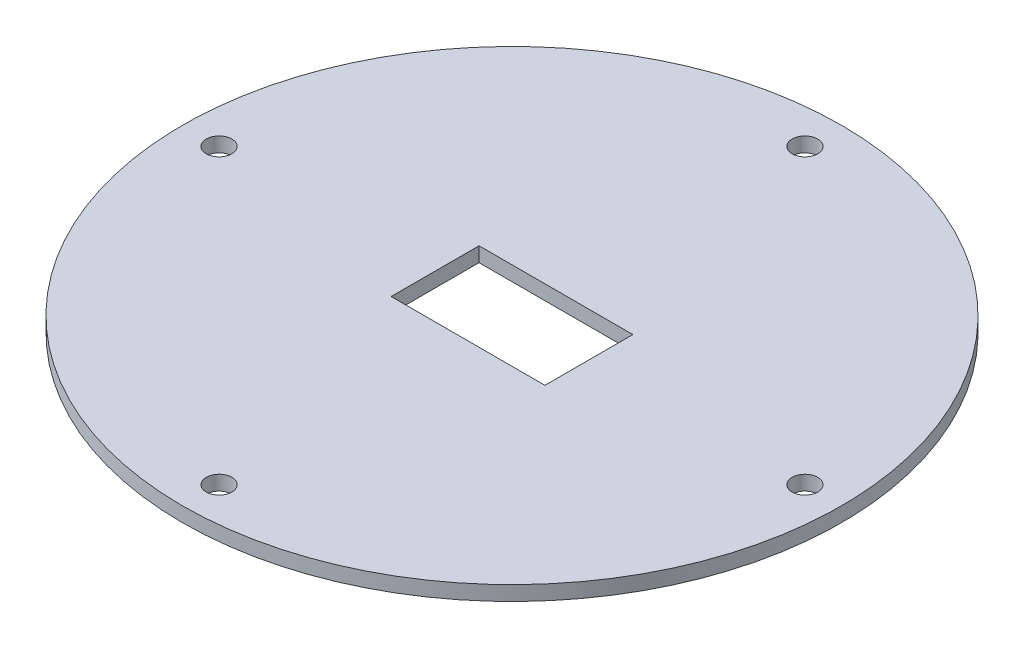
ISO-10303-21;
HEADER;
FILE_DESCRIPTION(('STEP AP214'),'2;1');
FILE_NAME('part.step','',(''),(''),'','','');
FILE_SCHEMA(('AUTOMOTIVE_DESIGN { 1 0 10303 214 1 1 1 1 }'));
ENDSEC;
DATA;
#1=APPLICATION_CONTEXT('core data for automotive mechanical design processes');
#2=APPLICATION_PROTOCOL_DEFINITION('international standard','automotive_design',2000,#1);
#3=PRODUCT_CONTEXT('',#1,'mechanical');
#4=PRODUCT('Part','Part','',(#3));
#5=PRODUCT_RELATED_PRODUCT_CATEGORY('part','',(#4));
#6=PRODUCT_DEFINITION_FORMATION('','',#4);
#7=PRODUCT_DEFINITION_CONTEXT('part definition',#1,'design');
#8=PRODUCT_DEFINITION('design','',#6,#7);
#9=PRODUCT_DEFINITION_SHAPE('','',#8);
#10=(LENGTH_UNIT() NAMED_UNIT(*) SI_UNIT(.MILLI.,.METRE.));
#11=(NAMED_UNIT(*) PLANE_ANGLE_UNIT() SI_UNIT($,.RADIAN.));
#12=(NAMED_UNIT(*) SI_UNIT($,.STERADIAN.) SOLID_ANGLE_UNIT());
#13=UNCERTAINTY_MEASURE_WITH_UNIT(LENGTH_MEASURE(1.E-05),#10,'distance_accuracy_value','');
#14=(GEOMETRIC_REPRESENTATION_CONTEXT(3) GLOBAL_UNCERTAINTY_ASSIGNED_CONTEXT((#13)) GLOBAL_UNIT_ASSIGNED_CONTEXT((#10,
#11,#12)) REPRESENTATION_CONTEXT('',''));
#15=CARTESIAN_POINT('',(0.,0.,0.));
#16=DIRECTION('',(0.,0.,1.));
#17=DIRECTION('',(1.,0.,0.));
#18=AXIS2_PLACEMENT_3D('',#15,#16,#17);
#19=CARTESIAN_POINT('',(0.,2.,0.));
#20=DIRECTION('',(0.,-1.,0.));
#21=DIRECTION('',(0.,0.,-1.));
#22=AXIS2_PLACEMENT_3D('',#19,#20,#21);
#23=CYLINDRICAL_SURFACE('',#22,45.);
#24=CARTESIAN_POINT('',(0.,2.,0.));
#25=DIRECTION('',(0.,1.,0.));
#26=DIRECTION('',(0.,0.,1.));
#27=AXIS2_PLACEMENT_3D('',#24,#25,#26);
#28=CIRCLE('',#27,45.);
#29=CARTESIAN_POINT('',(0.,2.,45.));
#30=VERTEX_POINT('',#29);
#31=EDGE_CURVE('E11',#30,#30,#28,.T.);
#32=ORIENTED_EDGE('',*,*,#31,.F.);
#33=EDGE_LOOP('',(#32));
#34=FACE_BOUND('',#33,.T.);
#35=CARTESIAN_POINT('',(0.,0.,0.));
#36=DIRECTION('',(0.,1.,0.));
#37=DIRECTION('',(0.,0.,1.));
#38=AXIS2_PLACEMENT_3D('',#35,#36,#37);
#39=CIRCLE('',#38,45.);
#40=CARTESIAN_POINT('',(0.,0.,45.));
#41=VERTEX_POINT('',#40);
#42=EDGE_CURVE('E49',#41,#41,#39,.T.);
#43=ORIENTED_EDGE('',*,*,#42,.T.);
#44=EDGE_LOOP('',(#43));
#45=FACE_BOUND('',#44,.T.);
#46=ADVANCED_FACE('F46',(#34,#45),#23,.T.);
#47=CARTESIAN_POINT('',(0.,2.,0.));
#48=DIRECTION('',(0.,1.,0.));
#49=DIRECTION('',(0.,0.,1.));
#50=AXIS2_PLACEMENT_3D('',#47,#48,#49);
#51=PLANE('',#50);
#52=DIRECTION('',(0.,0.,-1.));
#53=VECTOR('',#52,1.);
#54=CARTESIAN_POINT('',(10.5,2.,6.));
#55=LINE('',#54,#53);
#56=CARTESIAN_POINT('',(10.5,2.,6.));
#57=VERTEX_POINT('',#56);
#58=CARTESIAN_POINT('',(10.5,2.,-6.));
#59=VERTEX_POINT('',#58);
#60=EDGE_CURVE('E61',#57,#59,#55,.T.);
#61=ORIENTED_EDGE('',*,*,#60,.F.);
#62=DIRECTION('',(1.,0.,0.));
#63=VECTOR('',#62,1.);
#64=CARTESIAN_POINT('',(-10.5,2.,6.));
#65=LINE('',#64,#63);
#66=CARTESIAN_POINT('',(-10.5,2.,6.));
#67=VERTEX_POINT('',#66);
#68=EDGE_CURVE('E108',#67,#57,#65,.T.);
#69=ORIENTED_EDGE('',*,*,#68,.F.);
#70=DIRECTION('',(0.,0.,1.));
#71=VECTOR('',#70,1.);
#72=CARTESIAN_POINT('',(-10.5,2.,6.));
#73=LINE('',#72,#71);
#74=CARTESIAN_POINT('',(-10.5,2.,-6.));
#75=VERTEX_POINT('',#74);
#76=EDGE_CURVE('E112',#75,#67,#73,.T.);
#77=ORIENTED_EDGE('',*,*,#76,.F.);
#78=DIRECTION('',(-1.,0.,0.));
#79=VECTOR('',#78,1.);
#80=CARTESIAN_POINT('',(-10.5,2.,-6.));
#81=LINE('',#80,#79);
#82=EDGE_CURVE('E121',#59,#75,#81,.T.);
#83=ORIENTED_EDGE('',*,*,#82,.F.);
#84=EDGE_LOOP('',(#61,#69,#77,#83));
#85=FACE_BOUND('',#84,.T.);
#86=CARTESIAN_POINT('',(0.,2.,-40.));
#87=DIRECTION('',(0.,1.,0.));
#88=DIRECTION('',(0.,0.,1.));
#89=AXIS2_PLACEMENT_3D('',#86,#87,#88);
#90=CIRCLE('',#89,1.75);
#91=CARTESIAN_POINT('',(0.,2.,-38.25));
#92=VERTEX_POINT('',#91);
#93=EDGE_CURVE('E140',#92,#92,#90,.T.);
#94=ORIENTED_EDGE('',*,*,#93,.F.);
#95=EDGE_LOOP('',(#94));
#96=FACE_BOUND('',#95,.T.);
#97=CARTESIAN_POINT('',(40.,2.,0.));
#98=DIRECTION('',(0.,1.,0.));
#99=DIRECTION('',(0.,0.,1.));
#100=AXIS2_PLACEMENT_3D('',#97,#98,#99);
#101=CIRCLE('',#100,1.75);
#102=CARTESIAN_POINT('',(40.,2.,1.75));
#103=VERTEX_POINT('',#102);
#104=EDGE_CURVE('E144',#103,#103,#101,.T.);
#105=ORIENTED_EDGE('',*,*,#104,.F.);
#106=EDGE_LOOP('',(#105));
#107=FACE_BOUND('',#106,.T.);
#108=CARTESIAN_POINT('',(0.,2.,40.));
#109=DIRECTION('',(0.,1.,0.));
#110=DIRECTION('',(0.,0.,1.));
#111=AXIS2_PLACEMENT_3D('',#108,#109,#110);
#112=CIRCLE('',#111,1.75);
#113=CARTESIAN_POINT('',(0.,2.,41.75));
#114=VERTEX_POINT('',#113);
#115=EDGE_CURVE('E152',#114,#114,#112,.T.);
#116=ORIENTED_EDGE('',*,*,#115,.F.);
#117=EDGE_LOOP('',(#116));
#118=FACE_BOUND('',#117,.T.);
#119=CARTESIAN_POINT('',(-40.,2.,0.));
#120=DIRECTION('',(0.,1.,0.));
#121=DIRECTION('',(0.,0.,1.));
#122=AXIS2_PLACEMENT_3D('',#119,#120,#121);
#123=CIRCLE('',#122,1.75);
#124=CARTESIAN_POINT('',(-40.,2.,1.75));
#125=VERTEX_POINT('',#124);
#126=EDGE_CURVE('E160',#125,#125,#123,.T.);
#127=ORIENTED_EDGE('',*,*,#126,.F.);
#128=EDGE_LOOP('',(#127));
#129=FACE_BOUND('',#128,.T.);
#130=ORIENTED_EDGE('',*,*,#31,.T.);
#131=EDGE_LOOP('',(#130));
#132=FACE_BOUND('',#131,.T.);
#133=ADVANCED_FACE('F177',(#85,#96,#107,#118,#129,#132),#51,.T.);
#134=CARTESIAN_POINT('',(0.,0.,0.));
#135=DIRECTION('',(0.,1.,0.));
#136=DIRECTION('',(0.,0.,1.));
#137=AXIS2_PLACEMENT_3D('',#134,#135,#136);
#138=PLANE('',#137);
#139=DIRECTION('',(1.,0.,0.));
#140=VECTOR('',#139,1.);
#141=CARTESIAN_POINT('',(-10.5,0.,6.));
#142=LINE('',#141,#140);
#143=CARTESIAN_POINT('',(-10.5,0.,6.));
#144=VERTEX_POINT('',#143);
#145=CARTESIAN_POINT('',(10.5,0.,6.));
#146=VERTEX_POINT('',#145);
#147=EDGE_CURVE('E96',#144,#146,#142,.T.);
#148=ORIENTED_EDGE('',*,*,#147,.T.);
#149=DIRECTION('',(0.,0.,-1.));
#150=VECTOR('',#149,1.);
#151=CARTESIAN_POINT('',(10.5,0.,6.));
#152=LINE('',#151,#150);
#153=CARTESIAN_POINT('',(10.5,0.,-6.));
#154=VERTEX_POINT('',#153);
#155=EDGE_CURVE('E89',#146,#154,#152,.T.);
#156=ORIENTED_EDGE('',*,*,#155,.T.);
#157=DIRECTION('',(-1.,0.,0.));
#158=VECTOR('',#157,1.);
#159=CARTESIAN_POINT('',(-10.5,0.,-6.));
#160=LINE('',#159,#158);
#161=CARTESIAN_POINT('',(-10.5,0.,-6.));
#162=VERTEX_POINT('',#161);
#163=EDGE_CURVE('E99',#154,#162,#160,.T.);
#164=ORIENTED_EDGE('',*,*,#163,.T.);
#165=DIRECTION('',(0.,0.,1.));
#166=VECTOR('',#165,1.);
#167=CARTESIAN_POINT('',(-10.5,0.,6.));
#168=LINE('',#167,#166);
#169=EDGE_CURVE('E69',#162,#144,#168,.T.);
#170=ORIENTED_EDGE('',*,*,#169,.T.);
#171=EDGE_LOOP('',(#148,#156,#164,#170));
#172=FACE_BOUND('',#171,.T.);
#173=CARTESIAN_POINT('',(0.,0.,-40.));
#174=DIRECTION('',(0.,1.,0.));
#175=DIRECTION('',(0.,0.,1.));
#176=AXIS2_PLACEMENT_3D('',#173,#174,#175);
#177=CIRCLE('',#176,1.75);
#178=CARTESIAN_POINT('',(0.,0.,-38.25));
#179=VERTEX_POINT('',#178);
#180=EDGE_CURVE('E136',#179,#179,#177,.T.);
#181=ORIENTED_EDGE('',*,*,#180,.T.);
#182=EDGE_LOOP('',(#181));
#183=FACE_BOUND('',#182,.T.);
#184=CARTESIAN_POINT('',(40.,0.,0.));
#185=DIRECTION('',(0.,1.,0.));
#186=DIRECTION('',(0.,0.,1.));
#187=AXIS2_PLACEMENT_3D('',#184,#185,#186);
#188=CIRCLE('',#187,1.75);
#189=CARTESIAN_POINT('',(40.,0.,1.75));
#190=VERTEX_POINT('',#189);
#191=EDGE_CURVE('E148',#190,#190,#188,.T.);
#192=ORIENTED_EDGE('',*,*,#191,.T.);
#193=EDGE_LOOP('',(#192));
#194=FACE_BOUND('',#193,.T.);
#195=CARTESIAN_POINT('',(0.,0.,40.));
#196=DIRECTION('',(0.,1.,0.));
#197=DIRECTION('',(0.,0.,1.));
#198=AXIS2_PLACEMENT_3D('',#195,#196,#197);
#199=CIRCLE('',#198,1.75);
#200=CARTESIAN_POINT('',(0.,0.,41.75));
#201=VERTEX_POINT('',#200);
#202=EDGE_CURVE('E156',#201,#201,#199,.T.);
#203=ORIENTED_EDGE('',*,*,#202,.T.);
#204=EDGE_LOOP('',(#203));
#205=FACE_BOUND('',#204,.T.);
#206=CARTESIAN_POINT('',(-40.,0.,0.));
#207=DIRECTION('',(0.,1.,0.));
#208=DIRECTION('',(0.,0.,1.));
#209=AXIS2_PLACEMENT_3D('',#206,#207,#208);
#210=CIRCLE('',#209,1.75);
#211=CARTESIAN_POINT('',(-40.,0.,1.75));
#212=VERTEX_POINT('',#211);
#213=EDGE_CURVE('E130',#212,#212,#210,.T.);
#214=ORIENTED_EDGE('',*,*,#213,.T.);
#215=EDGE_LOOP('',(#214));
#216=FACE_BOUND('',#215,.T.);
#217=ORIENTED_EDGE('',*,*,#42,.F.);
#218=EDGE_LOOP('',(#217));
#219=FACE_BOUND('',#218,.T.);
#220=ADVANCED_FACE('F104',(#172,#183,#194,#205,#216,#219),#138,.F.);
#221=CARTESIAN_POINT('',(-40.,0.,0.));
#222=DIRECTION('',(0.,1.,0.));
#223=DIRECTION('',(0.,0.,1.));
#224=AXIS2_PLACEMENT_3D('',#221,#222,#223);
#225=CYLINDRICAL_SURFACE('',#224,1.75);
#226=ORIENTED_EDGE('',*,*,#213,.F.);
#227=EDGE_LOOP('',(#226));
#228=FACE_BOUND('',#227,.T.);
#229=ORIENTED_EDGE('',*,*,#126,.T.);
#230=EDGE_LOOP('',(#229));
#231=FACE_BOUND('',#230,.T.);
#232=ADVANCED_FACE('F170',(#228,#231),#225,.F.);
#233=CARTESIAN_POINT('',(0.,0.,40.));
#234=DIRECTION('',(0.,1.,0.));
#235=DIRECTION('',(0.,0.,1.));
#236=AXIS2_PLACEMENT_3D('',#233,#234,#235);
#237=CYLINDRICAL_SURFACE('',#236,1.75);
#238=ORIENTED_EDGE('',*,*,#202,.F.);
#239=EDGE_LOOP('',(#238));
#240=FACE_BOUND('',#239,.T.);
#241=ORIENTED_EDGE('',*,*,#115,.T.);
#242=EDGE_LOOP('',(#241));
#243=FACE_BOUND('',#242,.T.);
#244=ADVANCED_FACE('F173',(#240,#243),#237,.F.);
#245=CARTESIAN_POINT('',(40.,0.,0.));
#246=DIRECTION('',(0.,1.,0.));
#247=DIRECTION('',(0.,0.,1.));
#248=AXIS2_PLACEMENT_3D('',#245,#246,#247);
#249=CYLINDRICAL_SURFACE('',#248,1.75);
#250=ORIENTED_EDGE('',*,*,#191,.F.);
#251=EDGE_LOOP('',(#250));
#252=FACE_BOUND('',#251,.T.);
#253=ORIENTED_EDGE('',*,*,#104,.T.);
#254=EDGE_LOOP('',(#253));
#255=FACE_BOUND('',#254,.T.);
#256=ADVANCED_FACE('F196',(#252,#255),#249,.F.);
#257=CARTESIAN_POINT('',(0.,0.,-40.));
#258=DIRECTION('',(0.,1.,0.));
#259=DIRECTION('',(0.,0.,1.));
#260=AXIS2_PLACEMENT_3D('',#257,#258,#259);
#261=CYLINDRICAL_SURFACE('',#260,1.75);
#262=ORIENTED_EDGE('',*,*,#180,.F.);
#263=EDGE_LOOP('',(#262));
#264=FACE_BOUND('',#263,.T.);
#265=ORIENTED_EDGE('',*,*,#93,.T.);
#266=EDGE_LOOP('',(#265));
#267=FACE_BOUND('',#266,.T.);
#268=ADVANCED_FACE('F200',(#264,#267),#261,.F.);
#269=CARTESIAN_POINT('',(10.5,0.,6.));
#270=DIRECTION('',(1.,0.,0.));
#271=DIRECTION('',(0.,0.,-1.));
#272=AXIS2_PLACEMENT_3D('',#269,#270,#271);
#273=PLANE('',#272);
#274=ORIENTED_EDGE('',*,*,#60,.T.);
#275=DIRECTION('',(0.,1.,0.));
#276=VECTOR('',#275,1.);
#277=CARTESIAN_POINT('',(10.5,0.,-6.));
#278=LINE('',#277,#276);
#279=EDGE_CURVE('E85',#154,#59,#278,.T.);
#280=ORIENTED_EDGE('',*,*,#279,.F.);
#281=ORIENTED_EDGE('',*,*,#155,.F.);
#282=DIRECTION('',(0.,1.,0.));
#283=VECTOR('',#282,1.);
#284=CARTESIAN_POINT('',(10.5,0.,6.));
#285=LINE('',#284,#283);
#286=EDGE_CURVE('E127',#146,#57,#285,.T.);
#287=ORIENTED_EDGE('',*,*,#286,.T.);
#288=EDGE_LOOP('',(#274,#280,#281,#287));
#289=FACE_BOUND('',#288,.T.);
#290=ADVANCED_FACE('F87',(#289),#273,.F.);
#291=CARTESIAN_POINT('',(-10.5,0.,6.));
#292=DIRECTION('',(0.,0.,1.));
#293=DIRECTION('',(1.,0.,0.));
#294=AXIS2_PLACEMENT_3D('',#291,#292,#293);
#295=PLANE('',#294);
#296=ORIENTED_EDGE('',*,*,#68,.T.);
#297=ORIENTED_EDGE('',*,*,#286,.F.);
#298=ORIENTED_EDGE('',*,*,#147,.F.);
#299=DIRECTION('',(0.,1.,0.));
#300=VECTOR('',#299,1.);
#301=CARTESIAN_POINT('',(-10.5,0.,6.));
#302=LINE('',#301,#300);
#303=EDGE_CURVE('E131',#144,#67,#302,.T.);
#304=ORIENTED_EDGE('',*,*,#303,.T.);
#305=EDGE_LOOP('',(#296,#297,#298,#304));
#306=FACE_BOUND('',#305,.T.);
#307=ADVANCED_FACE('F206',(#306),#295,.F.);
#308=CARTESIAN_POINT('',(-10.5,0.,6.));
#309=DIRECTION('',(-1.,0.,0.));
#310=DIRECTION('',(0.,0.,1.));
#311=AXIS2_PLACEMENT_3D('',#308,#309,#310);
#312=PLANE('',#311);
#313=ORIENTED_EDGE('',*,*,#76,.T.);
#314=ORIENTED_EDGE('',*,*,#303,.F.);
#315=ORIENTED_EDGE('',*,*,#169,.F.);
#316=DIRECTION('',(0.,1.,0.));
#317=VECTOR('',#316,1.);
#318=CARTESIAN_POINT('',(-10.5,0.,-6.));
#319=LINE('',#318,#317);
#320=EDGE_CURVE('E95',#162,#75,#319,.T.);
#321=ORIENTED_EDGE('',*,*,#320,.T.);
#322=EDGE_LOOP('',(#313,#314,#315,#321));
#323=FACE_BOUND('',#322,.T.);
#324=ADVANCED_FACE('F209',(#323),#312,.F.);
#325=CARTESIAN_POINT('',(-10.5,0.,-6.));
#326=DIRECTION('',(0.,0.,-1.));
#327=DIRECTION('',(-1.,0.,0.));
#328=AXIS2_PLACEMENT_3D('',#325,#326,#327);
#329=PLANE('',#328);
#330=ORIENTED_EDGE('',*,*,#82,.T.);
#331=ORIENTED_EDGE('',*,*,#320,.F.);
#332=ORIENTED_EDGE('',*,*,#163,.F.);
#333=ORIENTED_EDGE('',*,*,#279,.T.);
#334=EDGE_LOOP('',(#330,#331,#332,#333));
#335=FACE_BOUND('',#334,.T.);
#336=ADVANCED_FACE('F100',(#335),#329,.F.);
#337=CLOSED_SHELL('',(#46,#133,#220,#232,#244,#256,#268,#290,#307,#324,#336));
#338=MANIFOLD_SOLID_BREP('B2',#337);
#339=ADVANCED_BREP_SHAPE_REPRESENTATION('',(#18,#338),#14);
#340=SHAPE_DEFINITION_REPRESENTATION(#9,#339);
ENDSEC;
END-ISO-10303-21;
